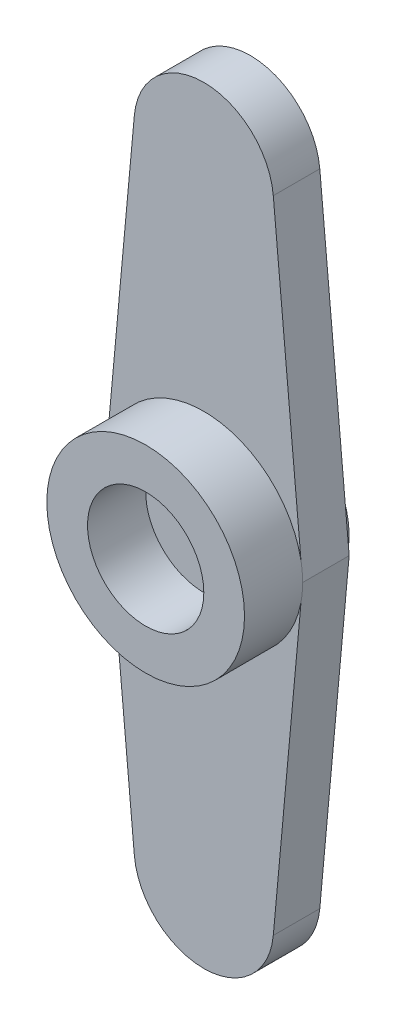
ISO-10303-21;
HEADER;
FILE_DESCRIPTION(('STEP AP214'),'2;1');
FILE_NAME('part.step','',(''),(''),'','','');
FILE_SCHEMA(('AUTOMOTIVE_DESIGN { 1 0 10303 214 1 1 1 1 }'));
ENDSEC;
DATA;
#1=APPLICATION_CONTEXT('core data for automotive mechanical design processes');
#2=APPLICATION_PROTOCOL_DEFINITION('international standard','automotive_design',2000,#1);
#3=PRODUCT_CONTEXT('',#1,'mechanical');
#4=PRODUCT('Part','Part','',(#3));
#5=PRODUCT_RELATED_PRODUCT_CATEGORY('part','',(#4));
#6=PRODUCT_DEFINITION_FORMATION('','',#4);
#7=PRODUCT_DEFINITION_CONTEXT('part definition',#1,'design');
#8=PRODUCT_DEFINITION('design','',#6,#7);
#9=PRODUCT_DEFINITION_SHAPE('','',#8);
#10=(LENGTH_UNIT() NAMED_UNIT(*) SI_UNIT(.MILLI.,.METRE.));
#11=(NAMED_UNIT(*) PLANE_ANGLE_UNIT() SI_UNIT($,.RADIAN.));
#12=(NAMED_UNIT(*) SI_UNIT($,.STERADIAN.) SOLID_ANGLE_UNIT());
#13=UNCERTAINTY_MEASURE_WITH_UNIT(LENGTH_MEASURE(1.E-05),#10,'distance_accuracy_value','');
#14=(GEOMETRIC_REPRESENTATION_CONTEXT(3) GLOBAL_UNCERTAINTY_ASSIGNED_CONTEXT((#13)) GLOBAL_UNIT_ASSIGNED_CONTEXT((#10,
#11,#12)) REPRESENTATION_CONTEXT('',''));
#15=CARTESIAN_POINT('',(0.,0.,0.));
#16=DIRECTION('',(0.,0.,1.));
#17=DIRECTION('',(1.,0.,0.));
#18=AXIS2_PLACEMENT_3D('',#15,#16,#17);
#19=CARTESIAN_POINT('',(0.,-13.5,-4.5));
#20=DIRECTION('',(0.,0.,-1.));
#21=DIRECTION('',(1.,0.,0.));
#22=AXIS2_PLACEMENT_3D('',#19,#20,#21);
#23=PLANE('',#22);
#24=CARTESIAN_POINT('',(0.,0.,-4.5));
#25=DIRECTION('',(0.,0.,1.));
#26=DIRECTION('',(1.,0.,0.));
#27=AXIS2_PLACEMENT_3D('',#24,#25,#26);
#28=CIRCLE('',#27,1.);
#29=CARTESIAN_POINT('',(1.,0.,-4.5));
#30=VERTEX_POINT('',#29);
#31=EDGE_CURVE('E253',#30,#30,#28,.T.);
#32=ORIENTED_EDGE('',*,*,#31,.T.);
#33=EDGE_LOOP('',(#32));
#34=FACE_BOUND('',#33,.T.);
#35=CARTESIAN_POINT('',(0.,0.,-4.5));
#36=DIRECTION('',(0.,0.,1.));
#37=DIRECTION('',(1.,0.,0.));
#38=AXIS2_PLACEMENT_3D('',#35,#36,#37);
#39=CIRCLE('',#38,3.);
#40=CARTESIAN_POINT('',(3.,0.,-4.5));
#41=VERTEX_POINT('',#40);
#42=EDGE_CURVE('E261',#41,#41,#39,.T.);
#43=ORIENTED_EDGE('',*,*,#42,.F.);
#44=EDGE_LOOP('',(#43));
#45=FACE_BOUND('',#44,.T.);
#46=ADVANCED_FACE('F41',(#34,#45),#23,.T.);
#47=CARTESIAN_POINT('',(0.,0.,-2.5));
#48=DIRECTION('',(0.,0.,-1.));
#49=DIRECTION('',(1.,0.,0.));
#50=AXIS2_PLACEMENT_3D('',#47,#48,#49);
#51=PLANE('',#50);
#52=DIRECTION('',(0.0912783716587728,-0.995825415857279,0.));
#53=VECTOR('',#52,1.);
#54=CARTESIAN_POINT('',(-4.25,0.,-2.5));
#55=LINE('',#54,#53);
#56=CARTESIAN_POINT('',(-4.25,0.,-2.5));
#57=VERTEX_POINT('',#56);
#58=CARTESIAN_POINT('',(-4.17918020037224,-0.772627240534918,-2.5));
#59=VERTEX_POINT('',#58);
#60=EDGE_CURVE('E146',#57,#59,#55,.T.);
#61=ORIENTED_EDGE('',*,*,#60,.T.);
#62=CARTESIAN_POINT('',(0.,0.,-2.5));
#63=DIRECTION('',(0.,0.,1.));
#64=DIRECTION('',(1.,0.,0.));
#65=AXIS2_PLACEMENT_3D('',#62,#63,#64);
#66=CIRCLE('',#65,4.25);
#67=EDGE_CURVE('E184',#57,#59,#66,.T.);
#68=ORIENTED_EDGE('',*,*,#67,.F.);
#69=EDGE_LOOP('',(#61,#68));
#70=FACE_BOUND('',#69,.T.);
#71=ADVANCED_FACE('F201',(#70),#51,.T.);
#72=DIRECTION('',(-0.0912783716587731,-0.995825415857279,0.));
#73=VECTOR('',#72,1.);
#74=CARTESIAN_POINT('',(-4.25,0.,-2.5));
#75=LINE('',#74,#73);
#76=CARTESIAN_POINT('',(-4.17918020037224,0.772627240534919,-2.5));
#77=VERTEX_POINT('',#76);
#78=EDGE_CURVE('E49',#77,#57,#75,.T.);
#79=ORIENTED_EDGE('',*,*,#78,.T.);
#80=EDGE_CURVE('E185',#77,#57,#66,.T.);
#81=ORIENTED_EDGE('',*,*,#80,.F.);
#82=EDGE_LOOP('',(#79,#81));
#83=FACE_BOUND('',#82,.T.);
#84=ADVANCED_FACE('F208',(#83),#51,.T.);
#85=DIRECTION('',(-0.0912783716587731,0.995825415857279,0.));
#86=VECTOR('',#85,1.);
#87=CARTESIAN_POINT('',(2.98747624757184,13.7738351149763,-2.5));
#88=LINE('',#87,#86);
#89=CARTESIAN_POINT('',(4.25,0.,-2.5));
#90=VERTEX_POINT('',#89);
#91=CARTESIAN_POINT('',(4.17918020037224,0.772627240534919,-2.5));
#92=VERTEX_POINT('',#91);
#93=EDGE_CURVE('E157',#90,#92,#88,.T.);
#94=ORIENTED_EDGE('',*,*,#93,.T.);
#95=EDGE_CURVE('E171',#90,#92,#66,.T.);
#96=ORIENTED_EDGE('',*,*,#95,.F.);
#97=EDGE_LOOP('',(#94,#96));
#98=FACE_BOUND('',#97,.T.);
#99=ADVANCED_FACE('F295',(#98),#51,.T.);
#100=DIRECTION('',(0.0912783716587728,0.995825415857279,0.));
#101=VECTOR('',#100,1.);
#102=CARTESIAN_POINT('',(2.98747624757184,-13.7738351149763,-2.5));
#103=LINE('',#102,#101);
#104=CARTESIAN_POINT('',(4.17918020037224,-0.772627240534918,-2.5));
#105=VERTEX_POINT('',#104);
#106=EDGE_CURVE('E155',#105,#90,#103,.T.);
#107=ORIENTED_EDGE('',*,*,#106,.T.);
#108=EDGE_CURVE('E176',#105,#90,#66,.T.);
#109=ORIENTED_EDGE('',*,*,#108,.F.);
#110=EDGE_LOOP('',(#107,#109));
#111=FACE_BOUND('',#110,.T.);
#112=ADVANCED_FACE('F202',(#111),#51,.T.);
#113=CARTESIAN_POINT('',(0.,0.,0.));
#114=DIRECTION('',(0.,0.,-1.));
#115=DIRECTION('',(1.,0.,0.));
#116=AXIS2_PLACEMENT_3D('',#113,#114,#115);
#117=PLANE('',#116);
#118=CARTESIAN_POINT('',(0.,0.,0.));
#119=DIRECTION('',(0.,0.,1.));
#120=DIRECTION('',(1.,0.,0.));
#121=AXIS2_PLACEMENT_3D('',#118,#119,#120);
#122=CIRCLE('',#121,4.25);
#123=CARTESIAN_POINT('',(4.25,0.,0.));
#124=VERTEX_POINT('',#123);
#125=EDGE_CURVE('E44',#124,#124,#122,.T.);
#126=ORIENTED_EDGE('',*,*,#125,.T.);
#127=EDGE_LOOP('',(#126));
#128=FACE_BOUND('',#127,.T.);
#129=CARTESIAN_POINT('',(0.,0.,0.));
#130=DIRECTION('',(0.,0.,1.));
#131=DIRECTION('',(1.,0.,0.));
#132=AXIS2_PLACEMENT_3D('',#129,#130,#131);
#133=CIRCLE('',#132,2.5);
#134=CARTESIAN_POINT('',(2.5,0.,0.));
#135=VERTEX_POINT('',#134);
#136=EDGE_CURVE('E173',#135,#135,#133,.T.);
#137=ORIENTED_EDGE('',*,*,#136,.F.);
#138=EDGE_LOOP('',(#137));
#139=FACE_BOUND('',#138,.T.);
#140=ADVANCED_FACE('F188',(#128,#139),#117,.F.);
#141=CARTESIAN_POINT('',(0.,0.,-2.5));
#142=DIRECTION('',(0.,0.,1.));
#143=DIRECTION('',(-1.,0.,0.));
#144=AXIS2_PLACEMENT_3D('',#141,#142,#143);
#145=CYLINDRICAL_SURFACE('',#144,4.25);
#146=ORIENTED_EDGE('',*,*,#95,.T.);
#147=EDGE_CURVE('E172',#92,#77,#66,.T.);
#148=ORIENTED_EDGE('',*,*,#147,.T.);
#149=ORIENTED_EDGE('',*,*,#80,.T.);
#150=ORIENTED_EDGE('',*,*,#67,.T.);
#151=EDGE_CURVE('E183',#59,#105,#66,.T.);
#152=ORIENTED_EDGE('',*,*,#151,.T.);
#153=ORIENTED_EDGE('',*,*,#108,.T.);
#154=EDGE_LOOP('',(#146,#148,#149,#150,#152,#153));
#155=FACE_BOUND('',#154,.T.);
#156=ORIENTED_EDGE('',*,*,#125,.F.);
#157=EDGE_LOOP('',(#156));
#158=FACE_BOUND('',#157,.T.);
#159=ADVANCED_FACE('F43',(#155,#158),#145,.T.);
#160=CARTESIAN_POINT('',(0.,0.,-2.5));
#161=DIRECTION('',(0.,0.,1.));
#162=DIRECTION('',(-1.,0.,0.));
#163=AXIS2_PLACEMENT_3D('',#160,#161,#162);
#164=CYLINDRICAL_SURFACE('',#163,2.5);
#165=CARTESIAN_POINT('',(0.,0.,-2.5));
#166=DIRECTION('',(0.,0.,1.));
#167=DIRECTION('',(1.,0.,0.));
#168=AXIS2_PLACEMENT_3D('',#165,#166,#167);
#169=CIRCLE('',#168,2.5);
#170=CARTESIAN_POINT('',(2.5,0.,-2.5));
#171=VERTEX_POINT('',#170);
#172=EDGE_CURVE('E117',#171,#171,#169,.T.);
#173=ORIENTED_EDGE('',*,*,#172,.F.);
#174=EDGE_LOOP('',(#173));
#175=FACE_BOUND('',#174,.T.);
#176=ORIENTED_EDGE('',*,*,#136,.T.);
#177=EDGE_LOOP('',(#176));
#178=FACE_BOUND('',#177,.T.);
#179=ADVANCED_FACE('F194',(#175,#178),#164,.F.);
#180=CARTESIAN_POINT('',(0.,-13.5,-2.5));
#181=DIRECTION('',(0.,0.,-1.));
#182=DIRECTION('',(1.,0.,0.));
#183=AXIS2_PLACEMENT_3D('',#180,#181,#182);
#184=PLANE('',#183);
#185=CARTESIAN_POINT('',(2.98747624757184,13.7738351149763,-2.5));
#186=VERTEX_POINT('',#185);
#187=EDGE_CURVE('E153',#92,#186,#88,.T.);
#188=ORIENTED_EDGE('',*,*,#187,.T.);
#189=CARTESIAN_POINT('',(0.,13.5,-2.5));
#190=DIRECTION('',(0.,0.,1.));
#191=DIRECTION('',(-1.,0.,0.));
#192=AXIS2_PLACEMENT_3D('',#189,#190,#191);
#193=CIRCLE('',#192,3.);
#194=CARTESIAN_POINT('',(-2.98747624757184,13.7738351149763,-2.5));
#195=VERTEX_POINT('',#194);
#196=EDGE_CURVE('E132',#186,#195,#193,.T.);
#197=ORIENTED_EDGE('',*,*,#196,.T.);
#198=EDGE_CURVE('E135',#195,#77,#75,.T.);
#199=ORIENTED_EDGE('',*,*,#198,.T.);
#200=ORIENTED_EDGE('',*,*,#147,.F.);
#201=EDGE_LOOP('',(#188,#197,#199,#200));
#202=FACE_BOUND('',#201,.T.);
#203=ADVANCED_FACE('F199',(#202),#184,.F.);
#204=CARTESIAN_POINT('',(-2.98747624757184,-13.7738351149763,-2.5));
#205=VERTEX_POINT('',#204);
#206=EDGE_CURVE('E67',#59,#205,#55,.T.);
#207=ORIENTED_EDGE('',*,*,#206,.T.);
#208=CARTESIAN_POINT('',(0.,-13.5,-2.5));
#209=DIRECTION('',(0.,0.,1.));
#210=DIRECTION('',(1.,0.,0.));
#211=AXIS2_PLACEMENT_3D('',#208,#209,#210);
#212=CIRCLE('',#211,3.);
#213=CARTESIAN_POINT('',(2.98747624757184,-13.7738351149763,-2.5));
#214=VERTEX_POINT('',#213);
#215=EDGE_CURVE('E113',#205,#214,#212,.T.);
#216=ORIENTED_EDGE('',*,*,#215,.T.);
#217=EDGE_CURVE('E59',#214,#105,#103,.T.);
#218=ORIENTED_EDGE('',*,*,#217,.T.);
#219=ORIENTED_EDGE('',*,*,#151,.F.);
#220=EDGE_LOOP('',(#207,#216,#218,#219));
#221=FACE_BOUND('',#220,.T.);
#222=ADVANCED_FACE('F216',(#221),#184,.F.);
#223=CARTESIAN_POINT('',(0.,0.,-4.5));
#224=DIRECTION('',(0.,0.,1.));
#225=DIRECTION('',(1.,0.,0.));
#226=AXIS2_PLACEMENT_3D('',#223,#224,#225);
#227=CIRCLE('',#226,3.5);
#228=CARTESIAN_POINT('',(3.5,0.,-4.5));
#229=VERTEX_POINT('',#228);
#230=EDGE_CURVE('E11',#229,#229,#227,.T.);
#231=ORIENTED_EDGE('',*,*,#230,.T.);
#232=EDGE_LOOP('',(#231));
#233=FACE_BOUND('',#232,.T.);
#234=DIRECTION('',(0.0912783716587728,-0.995825415857279,0.));
#235=VECTOR('',#234,1.);
#236=CARTESIAN_POINT('',(-4.25,0.,-4.5));
#237=LINE('',#236,#235);
#238=CARTESIAN_POINT('',(-4.25,0.,-4.5));
#239=VERTEX_POINT('',#238);
#240=CARTESIAN_POINT('',(-2.98747624757184,-13.7738351149763,-4.5));
#241=VERTEX_POINT('',#240);
#242=EDGE_CURVE('E125',#239,#241,#237,.T.);
#243=ORIENTED_EDGE('',*,*,#242,.F.);
#244=DIRECTION('',(-0.0912783716587731,-0.995825415857279,0.));
#245=VECTOR('',#244,1.);
#246=CARTESIAN_POINT('',(-4.25,0.,-4.5));
#247=LINE('',#246,#245);
#248=CARTESIAN_POINT('',(-2.98747624757184,13.7738351149763,-4.5));
#249=VERTEX_POINT('',#248);
#250=EDGE_CURVE('E150',#249,#239,#247,.T.);
#251=ORIENTED_EDGE('',*,*,#250,.F.);
#252=CARTESIAN_POINT('',(0.,13.5,-4.5));
#253=DIRECTION('',(0.,0.,1.));
#254=DIRECTION('',(-1.,0.,0.));
#255=AXIS2_PLACEMENT_3D('',#252,#253,#254);
#256=CIRCLE('',#255,3.);
#257=CARTESIAN_POINT('',(2.98747624757184,13.7738351149763,-4.5));
#258=VERTEX_POINT('',#257);
#259=EDGE_CURVE('E143',#258,#249,#256,.T.);
#260=ORIENTED_EDGE('',*,*,#259,.F.);
#261=DIRECTION('',(-0.0912783716587731,0.995825415857279,0.));
#262=VECTOR('',#261,1.);
#263=CARTESIAN_POINT('',(2.98747624757184,13.7738351149763,-4.5));
#264=LINE('',#263,#262);
#265=CARTESIAN_POINT('',(4.25,0.,-4.5));
#266=VERTEX_POINT('',#265);
#267=EDGE_CURVE('E141',#266,#258,#264,.T.);
#268=ORIENTED_EDGE('',*,*,#267,.F.);
#269=DIRECTION('',(0.0912783716587728,0.995825415857279,0.));
#270=VECTOR('',#269,1.);
#271=CARTESIAN_POINT('',(2.98747624757184,-13.7738351149763,-4.5));
#272=LINE('',#271,#270);
#273=CARTESIAN_POINT('',(2.98747624757184,-13.7738351149763,-4.5));
#274=VERTEX_POINT('',#273);
#275=EDGE_CURVE('E130',#274,#266,#272,.T.);
#276=ORIENTED_EDGE('',*,*,#275,.F.);
#277=CARTESIAN_POINT('',(0.,-13.5,-4.5));
#278=DIRECTION('',(0.,0.,1.));
#279=DIRECTION('',(1.,0.,0.));
#280=AXIS2_PLACEMENT_3D('',#277,#278,#279);
#281=CIRCLE('',#280,3.);
#282=EDGE_CURVE('E111',#241,#274,#281,.T.);
#283=ORIENTED_EDGE('',*,*,#282,.F.);
#284=EDGE_LOOP('',(#243,#251,#260,#268,#276,#283));
#285=FACE_BOUND('',#284,.T.);
#286=ADVANCED_FACE('F122',(#233,#285),#23,.T.);
#287=ORIENTED_EDGE('',*,*,#172,.T.);
#288=EDGE_LOOP('',(#287));
#289=FACE_BOUND('',#288,.T.);
#290=CARTESIAN_POINT('',(0.,0.,-2.5));
#291=DIRECTION('',(0.,0.,1.));
#292=DIRECTION('',(1.,0.,0.));
#293=AXIS2_PLACEMENT_3D('',#290,#291,#292);
#294=CIRCLE('',#293,1.);
#295=CARTESIAN_POINT('',(1.,0.,-2.5));
#296=VERTEX_POINT('',#295);
#297=EDGE_CURVE('E140',#296,#296,#294,.T.);
#298=ORIENTED_EDGE('',*,*,#297,.F.);
#299=EDGE_LOOP('',(#298));
#300=FACE_BOUND('',#299,.T.);
#301=ADVANCED_FACE('F220',(#289,#300),#184,.F.);
#302=CARTESIAN_POINT('',(-4.25,0.,-4.5));
#303=DIRECTION('',(0.995825415857279,0.0912783716587728,0.));
#304=DIRECTION('',(-0.0912783716587729,0.995825415857279,0.));
#305=AXIS2_PLACEMENT_3D('',#302,#303,#304);
#306=PLANE('',#305);
#307=ORIENTED_EDGE('',*,*,#60,.F.);
#308=DIRECTION('',(0.,0.,1.));
#309=VECTOR('',#308,1.);
#310=CARTESIAN_POINT('',(-4.25,0.,-4.5));
#311=LINE('',#310,#309);
#312=EDGE_CURVE('E127',#239,#57,#311,.T.);
#313=ORIENTED_EDGE('',*,*,#312,.F.);
#314=ORIENTED_EDGE('',*,*,#242,.T.);
#315=DIRECTION('',(0.,0.,1.));
#316=VECTOR('',#315,1.);
#317=CARTESIAN_POINT('',(-2.98747624757184,-13.7738351149763,-4.5));
#318=LINE('',#317,#316);
#319=EDGE_CURVE('E110',#241,#205,#318,.T.);
#320=ORIENTED_EDGE('',*,*,#319,.T.);
#321=ORIENTED_EDGE('',*,*,#206,.F.);
#322=EDGE_LOOP('',(#307,#313,#314,#320,#321));
#323=FACE_BOUND('',#322,.T.);
#324=ADVANCED_FACE('F129',(#323),#306,.F.);
#325=CARTESIAN_POINT('',(0.,-13.5,-4.5));
#326=DIRECTION('',(0.,0.,1.));
#327=DIRECTION('',(-1.,0.,0.));
#328=AXIS2_PLACEMENT_3D('',#325,#326,#327);
#329=CYLINDRICAL_SURFACE('',#328,3.);
#330=ORIENTED_EDGE('',*,*,#215,.F.);
#331=ORIENTED_EDGE('',*,*,#319,.F.);
#332=ORIENTED_EDGE('',*,*,#282,.T.);
#333=DIRECTION('',(0.,0.,1.));
#334=VECTOR('',#333,1.);
#335=CARTESIAN_POINT('',(2.98747624757184,-13.7738351149763,-4.5));
#336=LINE('',#335,#334);
#337=EDGE_CURVE('E119',#274,#214,#336,.T.);
#338=ORIENTED_EDGE('',*,*,#337,.T.);
#339=EDGE_LOOP('',(#330,#331,#332,#338));
#340=FACE_BOUND('',#339,.T.);
#341=ADVANCED_FACE('F115',(#340),#329,.T.);
#342=CARTESIAN_POINT('',(2.98747624757184,-13.7738351149763,-4.5));
#343=DIRECTION('',(-0.995825415857279,0.0912783716587728,0.));
#344=DIRECTION('',(-0.0912783716587729,-0.995825415857279,0.));
#345=AXIS2_PLACEMENT_3D('',#342,#343,#344);
#346=PLANE('',#345);
#347=ORIENTED_EDGE('',*,*,#217,.F.);
#348=ORIENTED_EDGE('',*,*,#337,.F.);
#349=ORIENTED_EDGE('',*,*,#275,.T.);
#350=DIRECTION('',(0.,0.,1.));
#351=VECTOR('',#350,1.);
#352=CARTESIAN_POINT('',(4.25,0.,-4.5));
#353=LINE('',#352,#351);
#354=EDGE_CURVE('E168',#266,#90,#353,.T.);
#355=ORIENTED_EDGE('',*,*,#354,.T.);
#356=ORIENTED_EDGE('',*,*,#106,.F.);
#357=EDGE_LOOP('',(#347,#348,#349,#355,#356));
#358=FACE_BOUND('',#357,.T.);
#359=ADVANCED_FACE('F288',(#358),#346,.F.);
#360=CARTESIAN_POINT('',(2.98747624757184,13.7738351149763,-4.5));
#361=DIRECTION('',(-0.995825415857279,-0.0912783716587731,0.));
#362=DIRECTION('',(0.0912783716587731,-0.995825415857279,0.));
#363=AXIS2_PLACEMENT_3D('',#360,#361,#362);
#364=PLANE('',#363);
#365=ORIENTED_EDGE('',*,*,#93,.F.);
#366=ORIENTED_EDGE('',*,*,#354,.F.);
#367=ORIENTED_EDGE('',*,*,#267,.T.);
#368=DIRECTION('',(0.,0.,1.));
#369=VECTOR('',#368,1.);
#370=CARTESIAN_POINT('',(2.98747624757184,13.7738351149763,-4.5));
#371=LINE('',#370,#369);
#372=EDGE_CURVE('E163',#258,#186,#371,.T.);
#373=ORIENTED_EDGE('',*,*,#372,.T.);
#374=ORIENTED_EDGE('',*,*,#187,.F.);
#375=EDGE_LOOP('',(#365,#366,#367,#373,#374));
#376=FACE_BOUND('',#375,.T.);
#377=ADVANCED_FACE('F286',(#376),#364,.F.);
#378=CARTESIAN_POINT('',(0.,13.5,-4.5));
#379=DIRECTION('',(0.,0.,1.));
#380=DIRECTION('',(-1.,0.,0.));
#381=AXIS2_PLACEMENT_3D('',#378,#379,#380);
#382=CYLINDRICAL_SURFACE('',#381,3.);
#383=ORIENTED_EDGE('',*,*,#196,.F.);
#384=ORIENTED_EDGE('',*,*,#372,.F.);
#385=ORIENTED_EDGE('',*,*,#259,.T.);
#386=DIRECTION('',(0.,0.,1.));
#387=VECTOR('',#386,1.);
#388=CARTESIAN_POINT('',(-2.98747624757184,13.7738351149763,-4.5));
#389=LINE('',#388,#387);
#390=EDGE_CURVE('E162',#249,#195,#389,.T.);
#391=ORIENTED_EDGE('',*,*,#390,.T.);
#392=EDGE_LOOP('',(#383,#384,#385,#391));
#393=FACE_BOUND('',#392,.T.);
#394=ADVANCED_FACE('F249',(#393),#382,.T.);
#395=CARTESIAN_POINT('',(-4.25,0.,-4.5));
#396=DIRECTION('',(0.995825415857279,-0.0912783716587731,0.));
#397=DIRECTION('',(0.0912783716587731,0.995825415857279,0.));
#398=AXIS2_PLACEMENT_3D('',#395,#396,#397);
#399=PLANE('',#398);
#400=ORIENTED_EDGE('',*,*,#198,.F.);
#401=ORIENTED_EDGE('',*,*,#390,.F.);
#402=ORIENTED_EDGE('',*,*,#250,.T.);
#403=ORIENTED_EDGE('',*,*,#312,.T.);
#404=ORIENTED_EDGE('',*,*,#78,.F.);
#405=EDGE_LOOP('',(#400,#401,#402,#403,#404));
#406=FACE_BOUND('',#405,.T.);
#407=ADVANCED_FACE('F243',(#406),#399,.F.);
#408=CARTESIAN_POINT('',(0.,0.,-4.5));
#409=DIRECTION('',(0.,0.,1.));
#410=DIRECTION('',(-1.,0.,0.));
#411=AXIS2_PLACEMENT_3D('',#408,#409,#410);
#412=CYLINDRICAL_SURFACE('',#411,1.);
#413=ORIENTED_EDGE('',*,*,#31,.F.);
#414=EDGE_LOOP('',(#413));
#415=FACE_BOUND('',#414,.T.);
#416=ORIENTED_EDGE('',*,*,#297,.T.);
#417=EDGE_LOOP('',(#416));
#418=FACE_BOUND('',#417,.T.);
#419=ADVANCED_FACE('F236',(#415,#418),#412,.F.);
#420=CARTESIAN_POINT('',(0.,0.,-5.25));
#421=DIRECTION('',(0.,0.,-1.));
#422=DIRECTION('',(1.,0.,0.));
#423=AXIS2_PLACEMENT_3D('',#420,#421,#422);
#424=PLANE('',#423);
#425=CARTESIAN_POINT('',(0.,0.,-5.25));
#426=DIRECTION('',(0.,0.,1.));
#427=DIRECTION('',(1.,0.,0.));
#428=AXIS2_PLACEMENT_3D('',#425,#426,#427);
#429=CIRCLE('',#428,3.5);
#430=CARTESIAN_POINT('',(3.5,0.,-5.25));
#431=VERTEX_POINT('',#430);
#432=EDGE_CURVE('E256',#431,#431,#429,.T.);
#433=ORIENTED_EDGE('',*,*,#432,.F.);
#434=EDGE_LOOP('',(#433));
#435=FACE_BOUND('',#434,.T.);
#436=CARTESIAN_POINT('',(0.,0.,-5.25));
#437=DIRECTION('',(0.,0.,1.));
#438=DIRECTION('',(1.,0.,0.));
#439=AXIS2_PLACEMENT_3D('',#436,#437,#438);
#440=CIRCLE('',#439,3.);
#441=CARTESIAN_POINT('',(3.,0.,-5.25));
#442=VERTEX_POINT('',#441);
#443=EDGE_CURVE('E260',#442,#442,#440,.T.);
#444=ORIENTED_EDGE('',*,*,#443,.T.);
#445=EDGE_LOOP('',(#444));
#446=FACE_BOUND('',#445,.T.);
#447=ADVANCED_FACE('F229',(#435,#446),#424,.T.);
#448=CARTESIAN_POINT('',(0.,0.,-5.25));
#449=DIRECTION('',(0.,0.,1.));
#450=DIRECTION('',(-1.,0.,0.));
#451=AXIS2_PLACEMENT_3D('',#448,#449,#450);
#452=CYLINDRICAL_SURFACE('',#451,3.5);
#453=ORIENTED_EDGE('',*,*,#432,.T.);
#454=EDGE_LOOP('',(#453));
#455=FACE_BOUND('',#454,.T.);
#456=ORIENTED_EDGE('',*,*,#230,.F.);
#457=EDGE_LOOP('',(#456));
#458=FACE_BOUND('',#457,.T.);
#459=ADVANCED_FACE('F230',(#455,#458),#452,.T.);
#460=CARTESIAN_POINT('',(0.,0.,-5.25));
#461=DIRECTION('',(0.,0.,1.));
#462=DIRECTION('',(-1.,0.,0.));
#463=AXIS2_PLACEMENT_3D('',#460,#461,#462);
#464=CYLINDRICAL_SURFACE('',#463,3.);
#465=ORIENTED_EDGE('',*,*,#443,.F.);
#466=EDGE_LOOP('',(#465));
#467=FACE_BOUND('',#466,.T.);
#468=ORIENTED_EDGE('',*,*,#42,.T.);
#469=EDGE_LOOP('',(#468));
#470=FACE_BOUND('',#469,.T.);
#471=ADVANCED_FACE('F227',(#467,#470),#464,.F.);
#472=CLOSED_SHELL('',(#46,#71,#84,#99,#112,#140,#159,#179,#203,#222,#286,#301,#324,#341,#359,
#377,#394,#407,#419,#447,#459,#471));
#473=MANIFOLD_SOLID_BREP('B2',#472);
#474=ADVANCED_BREP_SHAPE_REPRESENTATION('',(#18,#473),#14);
#475=SHAPE_DEFINITION_REPRESENTATION(#9,#474);
ENDSEC;
END-ISO-10303-21;
